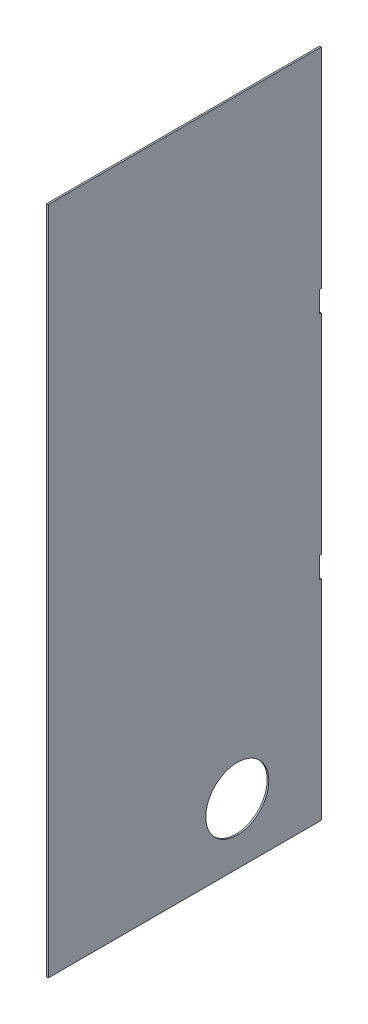
ISO-10303-21;
HEADER;
FILE_DESCRIPTION(('STEP AP214'),'2;1');
FILE_NAME('part.step','',(''),(''),'','','');
FILE_SCHEMA(('AUTOMOTIVE_DESIGN { 1 0 10303 214 1 1 1 1 }'));
ENDSEC;
DATA;
#1=APPLICATION_CONTEXT('core data for automotive mechanical design processes');
#2=APPLICATION_PROTOCOL_DEFINITION('international standard','automotive_design',2000,#1);
#3=PRODUCT_CONTEXT('',#1,'mechanical');
#4=PRODUCT('Part','Part','',(#3));
#5=PRODUCT_RELATED_PRODUCT_CATEGORY('part','',(#4));
#6=PRODUCT_DEFINITION_FORMATION('','',#4);
#7=PRODUCT_DEFINITION_CONTEXT('part definition',#1,'design');
#8=PRODUCT_DEFINITION('design','',#6,#7);
#9=PRODUCT_DEFINITION_SHAPE('','',#8);
#10=(LENGTH_UNIT() NAMED_UNIT(*) SI_UNIT(.MILLI.,.METRE.));
#11=(NAMED_UNIT(*) PLANE_ANGLE_UNIT() SI_UNIT($,.RADIAN.));
#12=(NAMED_UNIT(*) SI_UNIT($,.STERADIAN.) SOLID_ANGLE_UNIT());
#13=UNCERTAINTY_MEASURE_WITH_UNIT(LENGTH_MEASURE(1.E-05),#10,'distance_accuracy_value','');
#14=(GEOMETRIC_REPRESENTATION_CONTEXT(3) GLOBAL_UNCERTAINTY_ASSIGNED_CONTEXT((#13)) GLOBAL_UNIT_ASSIGNED_CONTEXT((#10,
#11,#12)) REPRESENTATION_CONTEXT('',''));
#15=CARTESIAN_POINT('',(0.,0.,0.));
#16=DIRECTION('',(0.,0.,1.));
#17=DIRECTION('',(1.,0.,0.));
#18=AXIS2_PLACEMENT_3D('',#15,#16,#17);
#19=CARTESIAN_POINT('',(728.,0.,-2.52575738102223E-12));
#20=DIRECTION('',(-1.,0.,0.));
#21=DIRECTION('',(0.,0.,1.));
#22=AXIS2_PLACEMENT_3D('',#19,#20,#21);
#23=PLANE('',#22);
#24=CARTESIAN_POINT('',(728.,-260.,78.5));
#25=DIRECTION('',(1.,0.,0.));
#26=DIRECTION('',(0.,0.,-1.));
#27=AXIS2_PLACEMENT_3D('',#24,#25,#26);
#28=CIRCLE('',#27,30.);
#29=CARTESIAN_POINT('',(728.,-260.,48.5));
#30=VERTEX_POINT('',#29);
#31=EDGE_CURVE('E238',#30,#30,#28,.T.);
#32=ORIENTED_EDGE('',*,*,#31,.F.);
#33=EDGE_LOOP('',(#32));
#34=FACE_BOUND('',#33,.T.);
#35=DIRECTION('',(0.,0.,-1.));
#36=VECTOR('',#35,1.);
#37=CARTESIAN_POINT('',(728.,-118.530964406271,0.1));
#38=LINE('',#37,#36);
#39=CARTESIAN_POINT('',(728.,-118.530964406271,0.1));
#40=VERTEX_POINT('',#39);
#41=CARTESIAN_POINT('',(728.,-118.530964406271,-1.5));
#42=VERTEX_POINT('',#41);
#43=EDGE_CURVE('E171',#40,#42,#38,.T.);
#44=ORIENTED_EDGE('',*,*,#43,.F.);
#45=DIRECTION('',(0.,1.,0.));
#46=VECTOR('',#45,1.);
#47=CARTESIAN_POINT('',(728.,-118.530964406271,0.1));
#48=LINE('',#47,#46);
#49=CARTESIAN_POINT('',(728.,-98.3309644062712,0.1));
#50=VERTEX_POINT('',#49);
#51=EDGE_CURVE('E162',#40,#50,#48,.T.);
#52=ORIENTED_EDGE('',*,*,#51,.T.);
#53=DIRECTION('',(0.,0.,-1.));
#54=VECTOR('',#53,1.);
#55=CARTESIAN_POINT('',(728.,-98.3309644062712,0.1));
#56=LINE('',#55,#54);
#57=CARTESIAN_POINT('',(728.,-98.3309644062712,-1.5));
#58=VERTEX_POINT('',#57);
#59=EDGE_CURVE('E182',#50,#58,#56,.T.);
#60=ORIENTED_EDGE('',*,*,#59,.T.);
#61=DIRECTION('',(0.,-1.,0.));
#62=VECTOR('',#61,1.);
#63=CARTESIAN_POINT('',(728.,0.,-1.5));
#64=LINE('',#63,#62);
#65=CARTESIAN_POINT('',(728.,100.684517796864,-1.5));
#66=VERTEX_POINT('',#65);
#67=EDGE_CURVE('E350',#66,#58,#64,.T.);
#68=ORIENTED_EDGE('',*,*,#67,.F.);
#69=DIRECTION('',(0.,0.,-1.));
#70=VECTOR('',#69,1.);
#71=CARTESIAN_POINT('',(728.,100.684517796864,0.1));
#72=LINE('',#71,#70);
#73=CARTESIAN_POINT('',(728.,100.684517796864,0.1));
#74=VERTEX_POINT('',#73);
#75=EDGE_CURVE('E176',#74,#66,#72,.T.);
#76=ORIENTED_EDGE('',*,*,#75,.F.);
#77=DIRECTION('',(0.,1.,0.));
#78=VECTOR('',#77,1.);
#79=CARTESIAN_POINT('',(728.,100.684517796864,0.1));
#80=LINE('',#79,#78);
#81=CARTESIAN_POINT('',(728.,120.884517796864,0.1));
#82=VERTEX_POINT('',#81);
#83=EDGE_CURVE('E192',#74,#82,#80,.T.);
#84=ORIENTED_EDGE('',*,*,#83,.T.);
#85=DIRECTION('',(0.,0.,-1.));
#86=VECTOR('',#85,1.);
#87=CARTESIAN_POINT('',(728.,120.884517796864,0.1));
#88=LINE('',#87,#86);
#89=CARTESIAN_POINT('',(728.,120.884517796864,-1.5));
#90=VERTEX_POINT('',#89);
#91=EDGE_CURVE('E205',#82,#90,#88,.T.);
#92=ORIENTED_EDGE('',*,*,#91,.T.);
#93=CARTESIAN_POINT('',(728.,320.,-1.5));
#94=VERTEX_POINT('',#93);
#95=EDGE_CURVE('E220',#94,#90,#64,.T.);
#96=ORIENTED_EDGE('',*,*,#95,.F.);
#97=DIRECTION('',(0.,0.,1.));
#98=VECTOR('',#97,1.);
#99=CARTESIAN_POINT('',(728.000000000001,320.,-1.5));
#100=LINE('',#99,#98);
#101=CARTESIAN_POINT('',(728.000000000001,320.,258.5));
#102=VERTEX_POINT('',#101);
#103=EDGE_CURVE('E246',#102,#94,#100,.F.);
#104=ORIENTED_EDGE('',*,*,#103,.F.);
#105=DIRECTION('',(0.,1.,0.));
#106=VECTOR('',#105,1.);
#107=CARTESIAN_POINT('',(728.000000000001,0.,258.5));
#108=LINE('',#107,#106);
#109=CARTESIAN_POINT('',(728.000000000001,-317.792893218814,258.5));
#110=VERTEX_POINT('',#109);
#111=EDGE_CURVE('E223',#110,#102,#108,.T.);
#112=ORIENTED_EDGE('',*,*,#111,.F.);
#113=DIRECTION('',(0.,0.,1.));
#114=VECTOR('',#113,1.);
#115=CARTESIAN_POINT('',(728.,-317.792893218814,-2.52575738102223E-12));
#116=LINE('',#115,#114);
#117=CARTESIAN_POINT('',(728.,-317.792893218814,1.));
#118=VERTEX_POINT('',#117);
#119=EDGE_CURVE('E221',#118,#110,#116,.T.);
#120=ORIENTED_EDGE('',*,*,#119,.F.);
#121=CARTESIAN_POINT('',(728.,-317.792893218814,1.));
#122=CARTESIAN_POINT('',(728.,-317.785944806708,0.90687557386482));
#123=CARTESIAN_POINT('',(728.,-317.779001364591,0.813750666015929));
#124=CARTESIAN_POINT('',(728.,-317.765281159909,0.627487483075377));
#125=CARTESIAN_POINT('',(728.,-317.758504399368,0.534349207835178));
#126=CARTESIAN_POINT('',(727.999999999999,-317.738660880626,0.254918404201129));
#127=CARTESIAN_POINT('',(727.999999999997,-317.726079381562,0.0685906193646238));
#128=CARTESIAN_POINT('',(727.999999999997,-317.70018630794,-0.347993530088105));
#129=CARTESIAN_POINT('',(728.,-317.687397996636,-0.578283009925216));
#130=CARTESIAN_POINT('',(728.,-317.670470206659,-0.923839383547922));
#131=CARTESIAN_POINT('',(727.999999999999,-317.665203124079,-1.03905259168801));
#132=CARTESIAN_POINT('',(728.000000000001,-317.655340926058,-1.26950688956622));
#133=CARTESIAN_POINT('',(728.000000000004,-317.65074580507,-1.3847479790663));
#134=CARTESIAN_POINT('',(728.00000000001,-317.646446609407,-1.50000000000004));
#135=B_SPLINE_CURVE_WITH_KNOTS('',3,(#121,#122,#123,#124,#125,#126,#127,#128,#129,#130,#131,
#132,#133,#134),.UNSPECIFIED.,.F.,.F.,(4,2,2,2,2,2,4),(0.,0.280150009180549,0.560303419019101,
1.12055222826661,1.81246142168486,2.15846039154658,2.50445650482591),.UNSPECIFIED.);
#136=CARTESIAN_POINT('',(727.999999999997,-317.646446609407,-1.50000000000001));
#137=VERTEX_POINT('',#136);
#138=EDGE_CURVE('E281',#118,#137,#135,.T.);
#139=ORIENTED_EDGE('',*,*,#138,.T.);
#140=EDGE_CURVE('E180',#42,#137,#64,.T.);
#141=ORIENTED_EDGE('',*,*,#140,.F.);
#142=EDGE_LOOP('',(#44,#52,#60,#68,#76,#84,#92,#96,#104,#112,#120,#139,#141));
#143=FACE_BOUND('',#142,.T.);
#144=ADVANCED_FACE('F42',(#34,#143),#23,.F.);
#145=CARTESIAN_POINT('',(0.,0.,-1.5));
#146=DIRECTION('',(0.,0.,-1.));
#147=DIRECTION('',(-1.,0.,0.));
#148=AXIS2_PLACEMENT_3D('',#145,#146,#147);
#149=PLANE('',#148);
#150=DIRECTION('',(0.,1.,0.));
#151=VECTOR('',#150,1.);
#152=CARTESIAN_POINT('',(726.5,0.,-1.5));
#153=LINE('',#152,#151);
#154=CARTESIAN_POINT('',(726.5,-317.570949809759,-1.5));
#155=VERTEX_POINT('',#154);
#156=CARTESIAN_POINT('',(726.5,-118.530964406271,-1.5));
#157=VERTEX_POINT('',#156);
#158=EDGE_CURVE('E11',#155,#157,#153,.T.);
#159=ORIENTED_EDGE('',*,*,#158,.T.);
#160=DIRECTION('',(1.,0.,0.));
#161=VECTOR('',#160,1.);
#162=CARTESIAN_POINT('',(0.,-118.530964406271,-1.5));
#163=LINE('',#162,#161);
#164=EDGE_CURVE('E214',#157,#42,#163,.T.);
#165=ORIENTED_EDGE('',*,*,#164,.T.);
#166=ORIENTED_EDGE('',*,*,#140,.T.);
#167=CARTESIAN_POINT('',(728.327665458443,-317.657900408724,-1.49999999999966));
#168=CARTESIAN_POINT('',(728.196411955859,-317.653605917649,-1.49999999999988));
#169=CARTESIAN_POINT('',(728.065168674546,-317.648975457501,-1.49999999999997));
#170=CARTESIAN_POINT('',(727.802710742853,-317.63892494946,-1.50000000000003));
#171=CARTESIAN_POINT('',(727.671496092871,-317.633504891211,-1.50000000000001));
#172=CARTESIAN_POINT('',(727.409130673508,-317.621758701229,-1.49999999999999));
#173=CARTESIAN_POINT('',(727.27797989688,-317.615432732783,-1.5));
#174=CARTESIAN_POINT('',(727.015730459383,-317.601793774022,-1.5));
#175=CARTESIAN_POINT('',(726.884631798182,-317.59448079011,-1.50000000000001));
#176=CARTESIAN_POINT('',(726.567133260067,-317.575548859786,-1.5));
#177=CARTESIAN_POINT('',(726.380763986909,-317.563415835954,-1.5));
#178=CARTESIAN_POINT('',(726.101287102674,-317.544073325812,-1.5));
#179=CARTESIAN_POINT('',(726.008138920848,-317.537435167344,-1.5));
#180=CARTESIAN_POINT('',(725.821860433457,-317.523911249359,-1.5));
#181=CARTESIAN_POINT('',(725.728730127912,-317.517025489578,-1.5));
#182=CARTESIAN_POINT('',(725.542478456478,-317.503183298862,-1.5));
#183=CARTESIAN_POINT('',(725.449357090382,-317.496226870658,-1.5));
#184=CARTESIAN_POINT('',(725.263113394519,-317.482327842329,-1.5));
#185=CARTESIAN_POINT('',(725.169991064753,-317.47538524219,-1.5));
#186=CARTESIAN_POINT('',(724.983752393692,-317.461497013402,-1.5));
#187=CARTESIAN_POINT('',(724.890636052381,-317.454551384965,-1.5));
#188=CARTESIAN_POINT('',(724.704403286342,-317.440660121868,-1.5));
#189=CARTESIAN_POINT('',(724.611286861614,-317.433714487208,-1.5));
#190=CARTESIAN_POINT('',(724.51817030595,-317.426770580116,-1.5));
#191=B_SPLINE_CURVE_WITH_KNOTS('',3,(#167,#168,#169,#170,#171,#172,#173,#174,#175,#176,#177,
#178,#179,#180,#181,#182,#183,#184,#185,#186,#187,#188,#189,#190),.UNSPECIFIED.,.F.,.F.,(4,2,2,
2,2,2,2,2,2,2,2,4),(0.,0.393971947815765,0.787949062789577,1.18185525341674,1.57575888873559,
2.13604019778705,2.41619323700692,2.69634657479435,2.97648912336507,3.25663141948609,
3.53675648820342,3.81688180786855),.UNSPECIFIED.);
#192=EDGE_CURVE('E256',#155,#137,#191,.F.);
#193=ORIENTED_EDGE('',*,*,#192,.F.);
#194=EDGE_LOOP('',(#159,#165,#166,#193));
#195=FACE_BOUND('',#194,.T.);
#196=ADVANCED_FACE('F291',(#195),#149,.T.);
#197=ORIENTED_EDGE('',*,*,#67,.T.);
#198=DIRECTION('',(-1.,0.,0.));
#199=VECTOR('',#198,1.);
#200=CARTESIAN_POINT('',(0.,-98.3309644062712,-1.5));
#201=LINE('',#200,#199);
#202=CARTESIAN_POINT('',(726.5,-98.3309644062712,-1.5));
#203=VERTEX_POINT('',#202);
#204=EDGE_CURVE('E211',#58,#203,#201,.T.);
#205=ORIENTED_EDGE('',*,*,#204,.T.);
#206=CARTESIAN_POINT('',(726.5,100.684517796864,-1.5));
#207=VERTEX_POINT('',#206);
#208=EDGE_CURVE('E50',#203,#207,#153,.T.);
#209=ORIENTED_EDGE('',*,*,#208,.T.);
#210=DIRECTION('',(1.,0.,0.));
#211=VECTOR('',#210,1.);
#212=CARTESIAN_POINT('',(0.,100.684517796864,-1.5));
#213=LINE('',#212,#211);
#214=EDGE_CURVE('E185',#207,#66,#213,.T.);
#215=ORIENTED_EDGE('',*,*,#214,.T.);
#216=EDGE_LOOP('',(#197,#205,#209,#215));
#217=FACE_BOUND('',#216,.T.);
#218=ADVANCED_FACE('F295',(#217),#149,.T.);
#219=ORIENTED_EDGE('',*,*,#95,.T.);
#220=DIRECTION('',(-1.,0.,0.));
#221=VECTOR('',#220,1.);
#222=CARTESIAN_POINT('',(0.,120.884517796864,-1.5));
#223=LINE('',#222,#221);
#224=CARTESIAN_POINT('',(726.5,120.884517796864,-1.5));
#225=VERTEX_POINT('',#224);
#226=EDGE_CURVE('E181',#90,#225,#223,.T.);
#227=ORIENTED_EDGE('',*,*,#226,.T.);
#228=CARTESIAN_POINT('',(726.5,320.,-1.5));
#229=VERTEX_POINT('',#228);
#230=EDGE_CURVE('E51',#225,#229,#153,.T.);
#231=ORIENTED_EDGE('',*,*,#230,.T.);
#232=DIRECTION('',(-1.,0.,0.));
#233=VECTOR('',#232,1.);
#234=CARTESIAN_POINT('',(0.,320.,-1.5));
#235=LINE('',#234,#233);
#236=EDGE_CURVE('E217',#229,#94,#235,.F.);
#237=ORIENTED_EDGE('',*,*,#236,.T.);
#238=EDGE_LOOP('',(#219,#227,#231,#237));
#239=FACE_BOUND('',#238,.T.);
#240=ADVANCED_FACE('F297',(#239),#149,.T.);
#241=CARTESIAN_POINT('',(726.5,0.,-2.4980018054066E-12));
#242=DIRECTION('',(-1.,0.,0.));
#243=DIRECTION('',(0.,0.,1.));
#244=AXIS2_PLACEMENT_3D('',#241,#242,#243);
#245=PLANE('',#244);
#246=CARTESIAN_POINT('',(726.5,-260.,78.5));
#247=DIRECTION('',(1.,0.,0.));
#248=DIRECTION('',(0.,0.,-1.));
#249=AXIS2_PLACEMENT_3D('',#246,#247,#248);
#250=CIRCLE('',#249,30.);
#251=CARTESIAN_POINT('',(726.5,-260.,48.5));
#252=VERTEX_POINT('',#251);
#253=EDGE_CURVE('E224',#252,#252,#250,.T.);
#254=ORIENTED_EDGE('',*,*,#253,.T.);
#255=EDGE_LOOP('',(#254));
#256=FACE_BOUND('',#255,.T.);
#257=DIRECTION('',(0.,-1.,0.));
#258=VECTOR('',#257,1.);
#259=CARTESIAN_POINT('',(726.5,-118.530964406271,0.1));
#260=LINE('',#259,#258);
#261=CARTESIAN_POINT('',(726.5,-98.3309644062712,0.1));
#262=VERTEX_POINT('',#261);
#263=CARTESIAN_POINT('',(726.5,-118.530964406271,0.1));
#264=VERTEX_POINT('',#263);
#265=EDGE_CURVE('E340',#262,#264,#260,.T.);
#266=ORIENTED_EDGE('',*,*,#265,.T.);
#267=DIRECTION('',(0.,0.,-1.));
#268=VECTOR('',#267,1.);
#269=CARTESIAN_POINT('',(726.5,-118.530964406271,0.1));
#270=LINE('',#269,#268);
#271=EDGE_CURVE('E174',#264,#157,#270,.T.);
#272=ORIENTED_EDGE('',*,*,#271,.T.);
#273=ORIENTED_EDGE('',*,*,#158,.F.);
#274=CARTESIAN_POINT('',(726.5,-317.792893218814,1.));
#275=CARTESIAN_POINT('',(726.5,-317.784324371402,0.954107675133951));
#276=CARTESIAN_POINT('',(726.5,-317.775774991241,0.908210002840005));
#277=CARTESIAN_POINT('',(726.5,-317.758973301724,0.816353934705337));
#278=CARTESIAN_POINT('',(726.5,-317.750721034314,0.770395531232684));
#279=CARTESIAN_POINT('',(726.5,-317.73477366688,0.678377417982182));
#280=CARTESIAN_POINT('',(726.5,-317.72707860853,0.632317700891865));
#281=CARTESIAN_POINT('',(726.5,-317.71239393555,0.540088929202285));
#282=CARTESIAN_POINT('',(726.5,-317.705404275057,0.493919881911379));
#283=CARTESIAN_POINT('',(726.5,-317.685591973652,0.355204992217193));
#284=CARTESIAN_POINT('',(726.5,-317.673932944999,0.262490517931134));
#285=CARTESIAN_POINT('',(726.5,-317.653420966988,0.0767457998022203));
#286=CARTESIAN_POINT('',(726.5,-317.644568419367,-0.0162844873233801));
#287=CARTESIAN_POINT('',(726.5,-317.628809452178,-0.204802182031488));
#288=CARTESIAN_POINT('',(726.5,-317.621956072855,-0.300293906663632));
#289=CARTESIAN_POINT('',(726.5,-317.609874211169,-0.491381824071716));
#290=CARTESIAN_POINT('',(726.5,-317.60464581375,-0.586978022046744));
#291=CARTESIAN_POINT('',(726.5,-317.590667265983,-0.873885717449257));
#292=CARTESIAN_POINT('',(726.499999999999,-317.583626525923,-1.06527823496015));
#293=CARTESIAN_POINT('',(726.499999999999,-317.571918897825,-1.44842283637707));
#294=CARTESIAN_POINT('',(726.5,-317.567255710079,-1.64017501740881));
#295=CARTESIAN_POINT('',(726.5,-317.561313776865,-1.92776022476219));
#296=CARTESIAN_POINT('',(726.5,-317.559509037222,-2.02358257346828));
#297=CARTESIAN_POINT('',(726.5,-317.55617958755,-2.21523057254312));
#298=CARTESIAN_POINT('',(726.5,-317.554654872856,-2.31105622283024));
#299=CARTESIAN_POINT('',(726.500000000001,-317.553235139561,-2.40688321877709));
#300=B_SPLINE_CURVE_WITH_KNOTS('',3,(#274,#275,#276,#277,#278,#279,#280,#281,#282,#283,#284,
#285,#286,#287,#288,#289,#290,#291,#292,#293,#294,#295,#296,#297,#298,#299),.UNSPECIFIED.,.F.,
.F.,(4,2,2,2,2,2,2,2,2,2,2,2,4),(0.,0.14005912891039,0.280137954596685,0.420227246157255,
0.560307423631156,0.840586893819974,1.1209064668585,1.40809933030763,1.69530720361174,
2.26983745843462,2.84525917203555,3.13277675809059,3.42028955285198),.UNSPECIFIED.);
#301=CARTESIAN_POINT('',(726.5,-317.792893218814,1.));
#302=VERTEX_POINT('',#301);
#303=EDGE_CURVE('E219',#302,#155,#300,.T.);
#304=ORIENTED_EDGE('',*,*,#303,.F.);
#305=DIRECTION('',(0.,0.,1.));
#306=VECTOR('',#305,1.);
#307=CARTESIAN_POINT('',(726.5,-317.792893218814,-2.4980018054066E-12));
#308=LINE('',#307,#306);
#309=CARTESIAN_POINT('',(726.500000000001,-317.792893218814,258.5));
#310=VERTEX_POINT('',#309);
#311=EDGE_CURVE('E228',#302,#310,#308,.T.);
#312=ORIENTED_EDGE('',*,*,#311,.T.);
#313=DIRECTION('',(0.,1.,0.));
#314=VECTOR('',#313,1.);
#315=CARTESIAN_POINT('',(726.500000000001,0.,258.5));
#316=LINE('',#315,#314);
#317=CARTESIAN_POINT('',(726.500000000001,320.,258.5));
#318=VERTEX_POINT('',#317);
#319=EDGE_CURVE('E231',#310,#318,#316,.T.);
#320=ORIENTED_EDGE('',*,*,#319,.T.);
#321=DIRECTION('',(0.,0.,1.));
#322=VECTOR('',#321,1.);
#323=CARTESIAN_POINT('',(726.5,320.,-1.5));
#324=LINE('',#323,#322);
#325=EDGE_CURVE('E243',#229,#318,#324,.T.);
#326=ORIENTED_EDGE('',*,*,#325,.F.);
#327=ORIENTED_EDGE('',*,*,#230,.F.);
#328=DIRECTION('',(0.,0.,-1.));
#329=VECTOR('',#328,1.);
#330=CARTESIAN_POINT('',(726.5,120.884517796864,0.1));
#331=LINE('',#330,#329);
#332=CARTESIAN_POINT('',(726.5,120.884517796864,0.1));
#333=VERTEX_POINT('',#332);
#334=EDGE_CURVE('E203',#333,#225,#331,.T.);
#335=ORIENTED_EDGE('',*,*,#334,.F.);
#336=DIRECTION('',(0.,-1.,0.));
#337=VECTOR('',#336,1.);
#338=CARTESIAN_POINT('',(726.5,100.684517796864,0.1));
#339=LINE('',#338,#337);
#340=CARTESIAN_POINT('',(726.5,100.684517796864,0.1));
#341=VERTEX_POINT('',#340);
#342=EDGE_CURVE('E197',#333,#341,#339,.T.);
#343=ORIENTED_EDGE('',*,*,#342,.T.);
#344=DIRECTION('',(0.,0.,-1.));
#345=VECTOR('',#344,1.);
#346=CARTESIAN_POINT('',(726.5,100.684517796864,0.1));
#347=LINE('',#346,#345);
#348=EDGE_CURVE('E200',#341,#207,#347,.T.);
#349=ORIENTED_EDGE('',*,*,#348,.T.);
#350=ORIENTED_EDGE('',*,*,#208,.F.);
#351=DIRECTION('',(0.,0.,-1.));
#352=VECTOR('',#351,1.);
#353=CARTESIAN_POINT('',(726.5,-98.3309644062712,0.1));
#354=LINE('',#353,#352);
#355=EDGE_CURVE('E187',#262,#203,#354,.T.);
#356=ORIENTED_EDGE('',*,*,#355,.F.);
#357=EDGE_LOOP('',(#266,#272,#273,#304,#312,#320,#326,#327,#335,#343,#349,#350,#356));
#358=FACE_BOUND('',#357,.T.);
#359=ADVANCED_FACE('F258',(#256,#358),#245,.T.);
#360=CARTESIAN_POINT('',(726.5,-317.792893218814,0.));
#361=DIRECTION('',(0.,-1.,0.));
#362=DIRECTION('',(0.,0.,-1.));
#363=AXIS2_PLACEMENT_3D('',#360,#361,#362);
#364=PLANE('',#363);
#365=ORIENTED_EDGE('',*,*,#119,.T.);
#366=DIRECTION('',(-1.,0.,0.));
#367=VECTOR('',#366,1.);
#368=CARTESIAN_POINT('',(728.000000000001,-317.792893218814,258.5));
#369=LINE('',#368,#367);
#370=EDGE_CURVE('E225',#110,#310,#369,.T.);
#371=ORIENTED_EDGE('',*,*,#370,.T.);
#372=ORIENTED_EDGE('',*,*,#311,.F.);
#373=DIRECTION('',(1.,0.,0.));
#374=VECTOR('',#373,1.);
#375=CARTESIAN_POINT('',(726.5,-317.792893218814,1.));
#376=LINE('',#375,#374);
#377=EDGE_CURVE('E216',#302,#118,#376,.T.);
#378=ORIENTED_EDGE('',*,*,#377,.T.);
#379=EDGE_LOOP('',(#365,#371,#372,#378));
#380=FACE_BOUND('',#379,.T.);
#381=ADVANCED_FACE('F272',(#380),#364,.T.);
#382=CARTESIAN_POINT('',(728.000000000001,-320.,258.5));
#383=DIRECTION('',(0.,0.,-1.));
#384=DIRECTION('',(-1.,0.,0.));
#385=AXIS2_PLACEMENT_3D('',#382,#383,#384);
#386=PLANE('',#385);
#387=DIRECTION('',(-1.,0.,0.));
#388=VECTOR('',#387,1.);
#389=CARTESIAN_POINT('',(728.000000000001,320.,258.5));
#390=LINE('',#389,#388);
#391=EDGE_CURVE('E227',#318,#102,#390,.F.);
#392=ORIENTED_EDGE('',*,*,#391,.F.);
#393=ORIENTED_EDGE('',*,*,#319,.F.);
#394=ORIENTED_EDGE('',*,*,#370,.F.);
#395=ORIENTED_EDGE('',*,*,#111,.T.);
#396=EDGE_LOOP('',(#392,#393,#394,#395));
#397=FACE_BOUND('',#396,.T.);
#398=ADVANCED_FACE('F335',(#397),#386,.F.);
#399=CARTESIAN_POINT('',(-730.,320.,-1.5));
#400=DIRECTION('',(0.,1.,0.));
#401=DIRECTION('',(0.,0.,1.));
#402=AXIS2_PLACEMENT_3D('',#399,#400,#401);
#403=PLANE('',#402);
#404=ORIENTED_EDGE('',*,*,#236,.F.);
#405=ORIENTED_EDGE('',*,*,#325,.T.);
#406=ORIENTED_EDGE('',*,*,#391,.T.);
#407=ORIENTED_EDGE('',*,*,#103,.T.);
#408=EDGE_LOOP('',(#404,#405,#406,#407));
#409=FACE_BOUND('',#408,.T.);
#410=ADVANCED_FACE('F269',(#409),#403,.T.);
#411=CARTESIAN_POINT('',(725.5,-317.5,-2.55074710937109));
#412=CARTESIAN_POINT('',(725.964875510826,-317.524412231068,-2.55074710937109));
#413=CARTESIAN_POINT('',(726.429400543773,-317.548815536469,-2.45833066628634));
#414=CARTESIAN_POINT('',(727.288223638777,-317.597631072938,-2.10259449265698));
#415=CARTESIAN_POINT('',(727.682099989522,-317.622038841172,-1.83941472910517));
#416=CARTESIAN_POINT('',(728.339414729103,-317.670854377641,-1.18209998952554));
#417=CARTESIAN_POINT('',(728.602594492659,-317.695262145876,-0.788223638776432));
#418=CARTESIAN_POINT('',(728.958330666277,-317.744077682345,0.0705994562267578));
#419=CARTESIAN_POINT('',(729.050747109371,-317.768480987753,0.535124489158717));
#420=CARTESIAN_POINT('',(729.050747109371,-317.792893218814,1.));
#421=CARTESIAN_POINT('',(725.5,-317.5,-1.51499999999999));
#422=CARTESIAN_POINT('',(725.829271764577,-317.524412145779,-1.51499999999999));
#423=CARTESIAN_POINT('',(726.158295929164,-317.548815536469,-1.44954128182079));
#424=CARTESIAN_POINT('',(726.766601735633,-317.597631072938,-1.19757276671092));
#425=CARTESIAN_POINT('',(727.045585000737,-317.622038841172,-1.01116210863139));
#426=CARTESIAN_POINT('',(727.511162108631,-317.670854377641,-0.545585000736898));
#427=CARTESIAN_POINT('',(727.697572766711,-317.695262145876,-0.26660173563281));
#428=CARTESIAN_POINT('',(727.949541281821,-317.744077682345,0.341704070836391));
#429=CARTESIAN_POINT('',(728.015,-317.768481073035,0.670728235423468));
#430=CARTESIAN_POINT('',(728.015,-317.792893218814,1.));
#431=CARTESIAN_POINT('',(725.5,-317.5,-1.5));
#432=CARTESIAN_POINT('',(725.82730791049,-317.524412144544,-1.5));
#433=CARTESIAN_POINT('',(726.154369710898,-317.548815536469,-1.43493169167078));
#434=CARTESIAN_POINT('',(726.759047450927,-317.597631072938,-1.18446597088562));
#435=CARTESIAN_POINT('',(727.036366799937,-317.622038841172,-0.99916710599543));
#436=CARTESIAN_POINT('',(727.499167105996,-317.670854377641,-0.536366799937266));
#437=CARTESIAN_POINT('',(727.684465970886,-317.695262145876,-0.259047450927252));
#438=CARTESIAN_POINT('',(727.934931691671,-317.744077682345,0.345630289101784));
#439=CARTESIAN_POINT('',(728.,-317.76848107427,0.672692089510596));
#440=CARTESIAN_POINT('',(728.,-317.792893218814,1.));
#441=CARTESIAN_POINT('',(725.5,-317.5,0.));
#442=CARTESIAN_POINT('',(725.630922501775,-317.524412021028,0.));
#443=CARTESIAN_POINT('',(725.761747884359,-317.548815536469,0.0260273233316788));
#444=CARTESIAN_POINT('',(726.003618980371,-317.597631072938,0.126213611645748));
#445=CARTESIAN_POINT('',(726.114546719975,-317.622038841172,0.200333157601817));
#446=CARTESIAN_POINT('',(726.299666842398,-317.670854377641,0.385453280025094));
#447=CARTESIAN_POINT('',(726.373786388354,-317.695262145876,0.496381019629094));
#448=CARTESIAN_POINT('',(726.473972676668,-317.744077682345,0.738252115640714));
#449=CARTESIAN_POINT('',(726.5,-317.768481197786,0.869077498224763));
#450=CARTESIAN_POINT('',(726.5,-317.792893218814,1.));
#451=CARTESIAN_POINT('',(725.5,-317.5,0.0151499999999916));
#452=CARTESIAN_POINT('',(725.628939009147,-317.52441201978,0.0151499999999916));
#453=CARTESIAN_POINT('',(725.757782403911,-317.548815536469,0.0407830093832051));
#454=CARTESIAN_POINT('',(725.995989152819,-317.597631072938,0.13945147542932));
#455=CARTESIAN_POINT('',(726.105236337167,-317.622038841172,0.212448110264163));
#456=CARTESIAN_POINT('',(726.287551889736,-317.670854377641,0.394763662832698));
#457=CARTESIAN_POINT('',(726.360548524571,-317.695262145876,0.504010847181713));
#458=CARTESIAN_POINT('',(726.459216990617,-317.744077682345,0.742217596088751));
#459=CARTESIAN_POINT('',(726.48485,-317.768481199033,0.871060990852768));
#460=CARTESIAN_POINT('',(726.48485,-317.792893218814,1.));
#461=CARTESIAN_POINT('',(725.5,-317.5,0.70710678118774));
#462=CARTESIAN_POINT('',(725.538345532289,-317.524411962802,0.70710678118774));
#463=CARTESIAN_POINT('',(725.576664180369,-317.548815536469,0.714730007695865));
#464=CARTESIAN_POINT('',(725.647506584225,-317.597631072938,0.744073892161152));
#465=CARTESIAN_POINT('',(725.679996566925,-317.622038841172,0.765783004553479));
#466=CARTESIAN_POINT('',(725.734216995449,-317.670854377641,0.820003433075515));
#467=CARTESIAN_POINT('',(725.755926107838,-317.695262145876,0.852493415784394));
#468=CARTESIAN_POINT('',(725.785269992317,-317.744077682345,0.92333581963253));
#469=CARTESIAN_POINT('',(725.792893218814,-317.768481256011,0.961654467709841));
#470=CARTESIAN_POINT('',(725.792893218814,-317.792893218814,1.));
#471=B_SPLINE_SURFACE_WITH_KNOTS('',1,3,((#411,#412,#413,#414,#415,#416,#417,#418,#419,#420),
(#421,#422,#423,#424,#425,#426,#427,#428,#429,#430),(#431,#432,#433,#434,#435,#436,#437,#438,
#439,#440),(#441,#442,#443,#444,#445,#446,#447,#448,#449,#450),(#451,#452,#453,#454,#455,#456,
#457,#458,#459,#460),(#461,#462,#463,#464,#465,#466,#467,#468,#469,#470)),.UNSPECIFIED.,.F.,.F.,
.F.,(2,1,1,1,1,2),(4,2,2,2,4),(-0.700498072914658,-0.01,0.,1.,1.0101,1.47140452079209),(0.,0.25,
0.5,0.75,1.),.UNSPECIFIED.);
#472=ORIENTED_EDGE('',*,*,#303,.T.);
#473=ORIENTED_EDGE('',*,*,#192,.T.);
#474=ORIENTED_EDGE('',*,*,#138,.F.);
#475=ORIENTED_EDGE('',*,*,#377,.F.);
#476=EDGE_LOOP('',(#472,#473,#474,#475));
#477=FACE_BOUND('',#476,.T.);
#478=ADVANCED_FACE('F261',(#477),#471,.F.);
#479=CARTESIAN_POINT('',(718.,-260.,78.5));
#480=DIRECTION('',(1.,0.,0.));
#481=DIRECTION('',(0.,0.,-1.));
#482=AXIS2_PLACEMENT_3D('',#479,#480,#481);
#483=CYLINDRICAL_SURFACE('',#482,30.);
#484=ORIENTED_EDGE('',*,*,#253,.F.);
#485=EDGE_LOOP('',(#484));
#486=FACE_BOUND('',#485,.T.);
#487=ORIENTED_EDGE('',*,*,#31,.T.);
#488=EDGE_LOOP('',(#487));
#489=FACE_BOUND('',#488,.T.);
#490=ADVANCED_FACE('F268',(#486,#489),#483,.F.);
#491=CARTESIAN_POINT('',(726.5,100.684517796864,0.1));
#492=DIRECTION('',(0.,1.,0.));
#493=DIRECTION('',(0.,0.,1.));
#494=AXIS2_PLACEMENT_3D('',#491,#492,#493);
#495=PLANE('',#494);
#496=ORIENTED_EDGE('',*,*,#348,.F.);
#497=DIRECTION('',(1.,0.,0.));
#498=VECTOR('',#497,1.);
#499=CARTESIAN_POINT('',(726.5,100.684517796864,0.1));
#500=LINE('',#499,#498);
#501=EDGE_CURVE('E74',#341,#74,#500,.T.);
#502=ORIENTED_EDGE('',*,*,#501,.T.);
#503=ORIENTED_EDGE('',*,*,#75,.T.);
#504=ORIENTED_EDGE('',*,*,#214,.F.);
#505=EDGE_LOOP('',(#496,#502,#503,#504));
#506=FACE_BOUND('',#505,.T.);
#507=ADVANCED_FACE('F298',(#506),#495,.T.);
#508=CARTESIAN_POINT('',(726.5,120.884517796864,0.1));
#509=DIRECTION('',(0.,-1.,0.));
#510=DIRECTION('',(0.,0.,-1.));
#511=AXIS2_PLACEMENT_3D('',#508,#509,#510);
#512=PLANE('',#511);
#513=ORIENTED_EDGE('',*,*,#91,.F.);
#514=DIRECTION('',(-1.,0.,0.));
#515=VECTOR('',#514,1.);
#516=CARTESIAN_POINT('',(726.5,120.884517796864,0.1));
#517=LINE('',#516,#515);
#518=EDGE_CURVE('E195',#82,#333,#517,.T.);
#519=ORIENTED_EDGE('',*,*,#518,.T.);
#520=ORIENTED_EDGE('',*,*,#334,.T.);
#521=ORIENTED_EDGE('',*,*,#226,.F.);
#522=EDGE_LOOP('',(#513,#519,#520,#521));
#523=FACE_BOUND('',#522,.T.);
#524=ADVANCED_FACE('F301',(#523),#512,.T.);
#525=CARTESIAN_POINT('',(0.,0.,0.1));
#526=DIRECTION('',(0.,0.,1.));
#527=DIRECTION('',(1.,0.,0.));
#528=AXIS2_PLACEMENT_3D('',#525,#526,#527);
#529=PLANE('',#528);
#530=ORIENTED_EDGE('',*,*,#501,.F.);
#531=ORIENTED_EDGE('',*,*,#342,.F.);
#532=ORIENTED_EDGE('',*,*,#518,.F.);
#533=ORIENTED_EDGE('',*,*,#83,.F.);
#534=EDGE_LOOP('',(#530,#531,#532,#533));
#535=FACE_BOUND('',#534,.T.);
#536=ADVANCED_FACE('F305',(#535),#529,.F.);
#537=CARTESIAN_POINT('',(726.5,-118.530964406271,0.1));
#538=DIRECTION('',(0.,1.,0.));
#539=DIRECTION('',(0.,0.,1.));
#540=AXIS2_PLACEMENT_3D('',#537,#538,#539);
#541=PLANE('',#540);
#542=ORIENTED_EDGE('',*,*,#271,.F.);
#543=DIRECTION('',(1.,0.,0.));
#544=VECTOR('',#543,1.);
#545=CARTESIAN_POINT('',(726.5,-118.530964406271,0.1));
#546=LINE('',#545,#544);
#547=EDGE_CURVE('E62',#264,#40,#546,.T.);
#548=ORIENTED_EDGE('',*,*,#547,.T.);
#549=ORIENTED_EDGE('',*,*,#43,.T.);
#550=ORIENTED_EDGE('',*,*,#164,.F.);
#551=EDGE_LOOP('',(#542,#548,#549,#550));
#552=FACE_BOUND('',#551,.T.);
#553=ADVANCED_FACE('F170',(#552),#541,.T.);
#554=CARTESIAN_POINT('',(726.5,-98.3309644062712,0.1));
#555=DIRECTION('',(0.,-1.,0.));
#556=DIRECTION('',(0.,0.,-1.));
#557=AXIS2_PLACEMENT_3D('',#554,#555,#556);
#558=PLANE('',#557);
#559=ORIENTED_EDGE('',*,*,#59,.F.);
#560=DIRECTION('',(-1.,0.,0.));
#561=VECTOR('',#560,1.);
#562=CARTESIAN_POINT('',(726.5,-98.3309644062712,0.1));
#563=LINE('',#562,#561);
#564=EDGE_CURVE('E164',#50,#262,#563,.T.);
#565=ORIENTED_EDGE('',*,*,#564,.T.);
#566=ORIENTED_EDGE('',*,*,#355,.T.);
#567=ORIENTED_EDGE('',*,*,#204,.F.);
#568=EDGE_LOOP('',(#559,#565,#566,#567));
#569=FACE_BOUND('',#568,.T.);
#570=ADVANCED_FACE('F311',(#569),#558,.T.);
#571=CARTESIAN_POINT('',(0.,0.,0.1));
#572=DIRECTION('',(0.,0.,1.));
#573=DIRECTION('',(1.,0.,0.));
#574=AXIS2_PLACEMENT_3D('',#571,#572,#573);
#575=PLANE('',#574);
#576=ORIENTED_EDGE('',*,*,#547,.F.);
#577=ORIENTED_EDGE('',*,*,#265,.F.);
#578=ORIENTED_EDGE('',*,*,#564,.F.);
#579=ORIENTED_EDGE('',*,*,#51,.F.);
#580=EDGE_LOOP('',(#576,#577,#578,#579));
#581=FACE_BOUND('',#580,.T.);
#582=ADVANCED_FACE('F163',(#581),#575,.F.);
#583=CLOSED_SHELL('',(#144,#196,#218,#240,#359,#381,#398,#410,#478,#490,#507,#524,#536,#553,
#570,#582));
#584=MANIFOLD_SOLID_BREP('B2',#583);
#585=ADVANCED_BREP_SHAPE_REPRESENTATION('',(#18,#584),#14);
#586=SHAPE_DEFINITION_REPRESENTATION(#9,#585);
ENDSEC;
END-ISO-10303-21;
